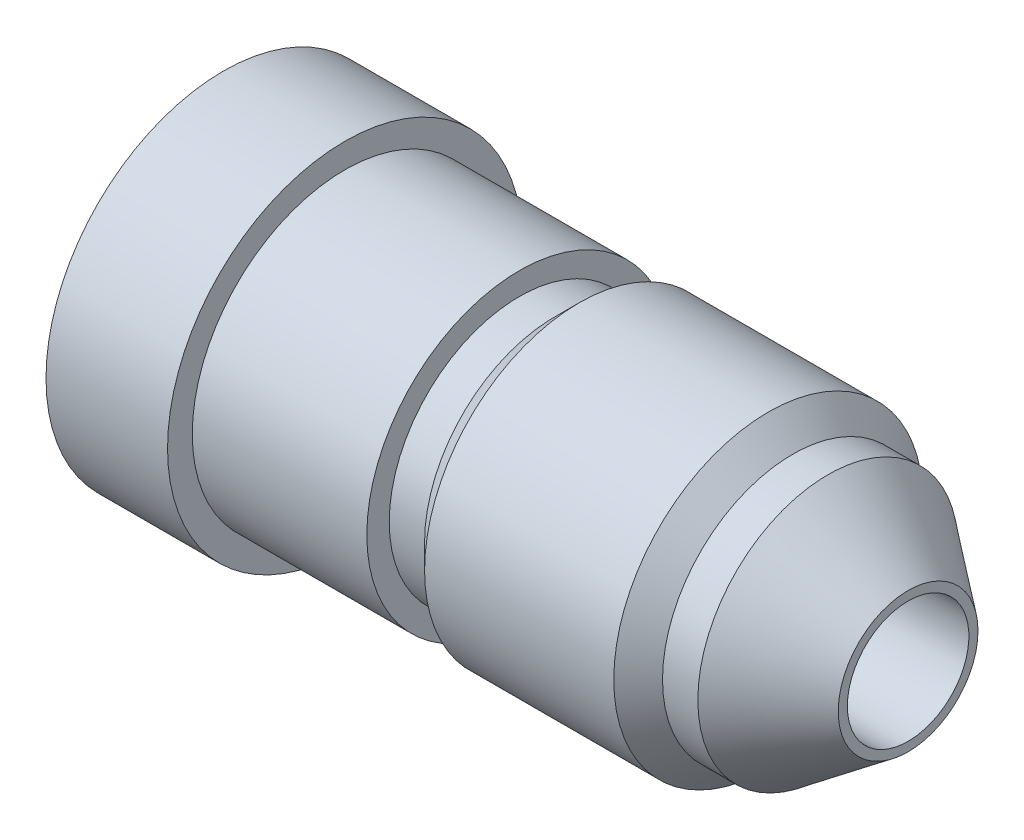
ISO-10303-21;
HEADER;
FILE_DESCRIPTION(('STEP AP214'),'2;1');
FILE_NAME('part.step','',(''),(''),'','','');
FILE_SCHEMA(('AUTOMOTIVE_DESIGN { 1 0 10303 214 1 1 1 1 }'));
ENDSEC;
DATA;
#1=APPLICATION_CONTEXT('core data for automotive mechanical design processes');
#2=APPLICATION_PROTOCOL_DEFINITION('international standard','automotive_design',2000,#1);
#3=PRODUCT_CONTEXT('',#1,'mechanical');
#4=PRODUCT('Part','Part','',(#3));
#5=PRODUCT_RELATED_PRODUCT_CATEGORY('part','',(#4));
#6=PRODUCT_DEFINITION_FORMATION('','',#4);
#7=PRODUCT_DEFINITION_CONTEXT('part definition',#1,'design');
#8=PRODUCT_DEFINITION('design','',#6,#7);
#9=PRODUCT_DEFINITION_SHAPE('','',#8);
#10=(LENGTH_UNIT() NAMED_UNIT(*) SI_UNIT(.MILLI.,.METRE.));
#11=(NAMED_UNIT(*) PLANE_ANGLE_UNIT() SI_UNIT($,.RADIAN.));
#12=(NAMED_UNIT(*) SI_UNIT($,.STERADIAN.) SOLID_ANGLE_UNIT());
#13=UNCERTAINTY_MEASURE_WITH_UNIT(LENGTH_MEASURE(1.E-05),#10,'distance_accuracy_value','');
#14=(GEOMETRIC_REPRESENTATION_CONTEXT(3) GLOBAL_UNCERTAINTY_ASSIGNED_CONTEXT((#13)) GLOBAL_UNIT_ASSIGNED_CONTEXT((#10,
#11,#12)) REPRESENTATION_CONTEXT('',''));
#15=CARTESIAN_POINT('',(0.,0.,0.));
#16=DIRECTION('',(0.,0.,1.));
#17=DIRECTION('',(1.,0.,0.));
#18=AXIS2_PLACEMENT_3D('',#15,#16,#17);
#19=CARTESIAN_POINT('',(-12.3063,0.,0.));
#20=DIRECTION('',(-1.,0.,0.));
#21=DIRECTION('',(0.,0.,1.));
#22=AXIS2_PLACEMENT_3D('',#19,#20,#21);
#23=CYLINDRICAL_SURFACE('',#22,5.55625);
#24=CARTESIAN_POINT('',(0.481989197104719,0.,0.));
#25=DIRECTION('',(1.,0.,0.));
#26=DIRECTION('',(0.,0.,-1.));
#27=AXIS2_PLACEMENT_3D('',#24,#25,#26);
#28=CIRCLE('',#27,5.55625);
#29=CARTESIAN_POINT('',(0.481989197104719,0.,-5.55625));
#30=VERTEX_POINT('',#29);
#31=EDGE_CURVE('E75',#30,#30,#28,.T.);
#32=ORIENTED_EDGE('',*,*,#31,.T.);
#33=EDGE_LOOP('',(#32));
#34=FACE_BOUND('',#33,.T.);
#35=CARTESIAN_POINT('',(7.28291304173335,0.,0.));
#36=DIRECTION('',(1.,0.,0.));
#37=DIRECTION('',(0.,0.,-1.));
#38=AXIS2_PLACEMENT_3D('',#35,#36,#37);
#39=CIRCLE('',#38,5.55625);
#40=CARTESIAN_POINT('',(7.28291304173335,0.,-5.55625));
#41=VERTEX_POINT('',#40);
#42=EDGE_CURVE('E72',#41,#41,#39,.T.);
#43=ORIENTED_EDGE('',*,*,#42,.F.);
#44=EDGE_LOOP('',(#43));
#45=FACE_BOUND('',#44,.T.);
#46=ADVANCED_FACE('F34',(#34,#45),#23,.T.);
#47=CARTESIAN_POINT('',(12.3063,2.1844,0.));
#48=DIRECTION('',(-1.,0.,0.));
#49=DIRECTION('',(0.,0.,1.));
#50=AXIS2_PLACEMENT_3D('',#47,#48,#49);
#51=PLANE('',#50);
#52=CARTESIAN_POINT('',(12.3063,0.,0.));
#53=DIRECTION('',(1.,0.,0.));
#54=DIRECTION('',(0.,0.,-1.));
#55=AXIS2_PLACEMENT_3D('',#52,#53,#54);
#56=CIRCLE('',#55,2.51206);
#57=CARTESIAN_POINT('',(12.3063,0.,-2.51206));
#58=VERTEX_POINT('',#57);
#59=EDGE_CURVE('E63',#58,#58,#56,.T.);
#60=ORIENTED_EDGE('',*,*,#59,.T.);
#61=EDGE_LOOP('',(#60));
#62=FACE_BOUND('',#61,.T.);
#63=CARTESIAN_POINT('',(12.3063,0.,0.));
#64=DIRECTION('',(-1.,0.,0.));
#65=DIRECTION('',(0.,0.,1.));
#66=AXIS2_PLACEMENT_3D('',#63,#64,#65);
#67=CIRCLE('',#66,2.1844);
#68=CARTESIAN_POINT('',(12.3063,0.,2.1844));
#69=VERTEX_POINT('',#68);
#70=EDGE_CURVE('E49',#69,#69,#67,.T.);
#71=ORIENTED_EDGE('',*,*,#70,.T.);
#72=EDGE_LOOP('',(#71));
#73=FACE_BOUND('',#72,.T.);
#74=ADVANCED_FACE('F105',(#62,#73),#51,.F.);
#75=CARTESIAN_POINT('',(-12.3063,0.,0.));
#76=DIRECTION('',(-1.,0.,0.));
#77=DIRECTION('',(0.,0.,1.));
#78=AXIS2_PLACEMENT_3D('',#75,#76,#77);
#79=CYLINDRICAL_SURFACE('',#78,6.3754);
#80=CARTESIAN_POINT('',(-12.3063,0.,0.));
#81=DIRECTION('',(-1.,0.,0.));
#82=DIRECTION('',(0.,0.,1.));
#83=AXIS2_PLACEMENT_3D('',#80,#81,#82);
#84=CIRCLE('',#83,6.3754);
#85=CARTESIAN_POINT('',(-12.3063,0.,6.3754));
#86=VERTEX_POINT('',#85);
#87=EDGE_CURVE('E60',#86,#86,#84,.T.);
#88=ORIENTED_EDGE('',*,*,#87,.F.);
#89=EDGE_LOOP('',(#88));
#90=FACE_BOUND('',#89,.T.);
#91=CARTESIAN_POINT('',(-7.9375,0.,0.));
#92=DIRECTION('',(-1.,0.,0.));
#93=DIRECTION('',(0.,0.,1.));
#94=AXIS2_PLACEMENT_3D('',#91,#92,#93);
#95=CIRCLE('',#94,6.3754);
#96=CARTESIAN_POINT('',(-7.9375,0.,6.3754));
#97=VERTEX_POINT('',#96);
#98=EDGE_CURVE('E10',#97,#97,#95,.T.);
#99=ORIENTED_EDGE('',*,*,#98,.T.);
#100=EDGE_LOOP('',(#99));
#101=FACE_BOUND('',#100,.T.);
#102=ADVANCED_FACE('F36',(#90,#101),#79,.T.);
#103=CARTESIAN_POINT('',(-7.9375,6.3754,0.));
#104=DIRECTION('',(-1.,0.,0.));
#105=DIRECTION('',(0.,0.,1.));
#106=AXIS2_PLACEMENT_3D('',#103,#104,#105);
#107=PLANE('',#106);
#108=ORIENTED_EDGE('',*,*,#98,.F.);
#109=EDGE_LOOP('',(#108));
#110=FACE_BOUND('',#109,.T.);
#111=CARTESIAN_POINT('',(-7.9375,0.,0.));
#112=DIRECTION('',(-1.,0.,0.));
#113=DIRECTION('',(0.,0.,1.));
#114=AXIS2_PLACEMENT_3D('',#111,#112,#113);
#115=CIRCLE('',#114,5.4864);
#116=CARTESIAN_POINT('',(-7.9375,0.,5.4864));
#117=VERTEX_POINT('',#116);
#118=EDGE_CURVE('E41',#117,#117,#115,.T.);
#119=ORIENTED_EDGE('',*,*,#118,.T.);
#120=EDGE_LOOP('',(#119));
#121=FACE_BOUND('',#120,.T.);
#122=ADVANCED_FACE('F119',(#110,#121),#107,.F.);
#123=CARTESIAN_POINT('',(-12.3063,0.,0.));
#124=DIRECTION('',(-1.,0.,0.));
#125=DIRECTION('',(0.,0.,1.));
#126=AXIS2_PLACEMENT_3D('',#123,#124,#125);
#127=CYLINDRICAL_SURFACE('',#126,5.4864);
#128=ORIENTED_EDGE('',*,*,#118,.F.);
#129=EDGE_LOOP('',(#128));
#130=FACE_BOUND('',#129,.T.);
#131=CARTESIAN_POINT('',(-1.6637,0.,0.));
#132=DIRECTION('',(-1.,0.,0.));
#133=DIRECTION('',(0.,0.,1.));
#134=AXIS2_PLACEMENT_3D('',#131,#132,#133);
#135=CIRCLE('',#134,5.4864);
#136=CARTESIAN_POINT('',(-1.6637,0.,5.4864));
#137=VERTEX_POINT('',#136);
#138=EDGE_CURVE('E45',#137,#137,#135,.T.);
#139=ORIENTED_EDGE('',*,*,#138,.T.);
#140=EDGE_LOOP('',(#139));
#141=FACE_BOUND('',#140,.T.);
#142=ADVANCED_FACE('F116',(#130,#141),#127,.T.);
#143=CARTESIAN_POINT('',(-12.3063,0.,0.));
#144=DIRECTION('',(-1.,0.,0.));
#145=DIRECTION('',(0.,0.,1.));
#146=AXIS2_PLACEMENT_3D('',#143,#144,#145);
#147=CYLINDRICAL_SURFACE('',#146,2.1844);
#148=ORIENTED_EDGE('',*,*,#70,.F.);
#149=EDGE_LOOP('',(#148));
#150=FACE_BOUND('',#149,.T.);
#151=CARTESIAN_POINT('',(-7.77271677589813,0.,0.));
#152=DIRECTION('',(-1.,0.,0.));
#153=DIRECTION('',(0.,0.,1.));
#154=AXIS2_PLACEMENT_3D('',#151,#152,#153);
#155=CIRCLE('',#154,2.1844);
#156=CARTESIAN_POINT('',(-7.77271677589813,0.,2.1844));
#157=VERTEX_POINT('',#156);
#158=EDGE_CURVE('E54',#157,#157,#155,.T.);
#159=ORIENTED_EDGE('',*,*,#158,.T.);
#160=EDGE_LOOP('',(#159));
#161=FACE_BOUND('',#160,.T.);
#162=ADVANCED_FACE('F118',(#150,#161),#147,.F.);
#163=CARTESIAN_POINT('',(-12.3063,0.,0.));
#164=DIRECTION('',(-1.,0.,0.));
#165=DIRECTION('',(0.,0.,1.));
#166=AXIS2_PLACEMENT_3D('',#163,#164,#165);
#167=CONICAL_SURFACE('',#166,5.6007,0.645771823237896);
#168=ORIENTED_EDGE('',*,*,#158,.F.);
#169=EDGE_LOOP('',(#168));
#170=FACE_BOUND('',#169,.T.);
#171=CARTESIAN_POINT('',(-12.3063,0.,0.));
#172=DIRECTION('',(-1.,0.,0.));
#173=DIRECTION('',(0.,0.,1.));
#174=AXIS2_PLACEMENT_3D('',#171,#172,#173);
#175=CIRCLE('',#174,5.6007);
#176=CARTESIAN_POINT('',(-12.3063,0.,5.6007));
#177=VERTEX_POINT('',#176);
#178=EDGE_CURVE('E57',#177,#177,#175,.T.);
#179=ORIENTED_EDGE('',*,*,#178,.T.);
#180=EDGE_LOOP('',(#179));
#181=FACE_BOUND('',#180,.T.);
#182=ADVANCED_FACE('F100',(#170,#181),#167,.F.);
#183=CARTESIAN_POINT('',(-12.3063,6.3754,0.));
#184=DIRECTION('',(1.,0.,0.));
#185=DIRECTION('',(0.,0.,-1.));
#186=AXIS2_PLACEMENT_3D('',#183,#184,#185);
#187=PLANE('',#186);
#188=ORIENTED_EDGE('',*,*,#178,.F.);
#189=EDGE_LOOP('',(#188));
#190=FACE_BOUND('',#189,.T.);
#191=ORIENTED_EDGE('',*,*,#87,.T.);
#192=EDGE_LOOP('',(#191));
#193=FACE_BOUND('',#192,.T.);
#194=ADVANCED_FACE('F90',(#190,#193),#187,.F.);
#195=CARTESIAN_POINT('',(-1.6637,5.4864,0.));
#196=DIRECTION('',(1.,0.,0.));
#197=DIRECTION('',(0.,0.,-1.));
#198=AXIS2_PLACEMENT_3D('',#195,#196,#197);
#199=PLANE('',#198);
#200=ORIENTED_EDGE('',*,*,#138,.F.);
#201=EDGE_LOOP('',(#200));
#202=FACE_BOUND('',#201,.T.);
#203=CARTESIAN_POINT('',(-1.66369999999997,0.,0.));
#204=DIRECTION('',(1.,0.,0.));
#205=DIRECTION('',(0.,0.,-1.));
#206=AXIS2_PLACEMENT_3D('',#203,#204,#205);
#207=CIRCLE('',#206,4.68056080289531);
#208=CARTESIAN_POINT('',(-1.66369999999997,0.,-4.68056080289531));
#209=VERTEX_POINT('',#208);
#210=EDGE_CURVE('E81',#209,#209,#207,.T.);
#211=ORIENTED_EDGE('',*,*,#210,.F.);
#212=EDGE_LOOP('',(#211));
#213=FACE_BOUND('',#212,.T.);
#214=ADVANCED_FACE('F87',(#202,#213),#199,.T.);
#215=CARTESIAN_POINT('',(9.42860223883804,0.,0.));
#216=DIRECTION('',(-1.,0.,0.));
#217=DIRECTION('',(0.,0.,1.));
#218=AXIS2_PLACEMENT_3D('',#215,#216,#217);
#219=CONICAL_SURFACE('',#218,4.68056080289531,0.645771823237896);
#220=ORIENTED_EDGE('',*,*,#59,.F.);
#221=EDGE_LOOP('',(#220));
#222=FACE_BOUND('',#221,.T.);
#223=CARTESIAN_POINT('',(9.42860223883804,0.,0.));
#224=DIRECTION('',(1.,0.,0.));
#225=DIRECTION('',(0.,0.,-1.));
#226=AXIS2_PLACEMENT_3D('',#223,#224,#225);
#227=CIRCLE('',#226,4.68056080289531);
#228=CARTESIAN_POINT('',(9.42860223883804,0.,-4.68056080289531));
#229=VERTEX_POINT('',#228);
#230=EDGE_CURVE('E66',#229,#229,#227,.T.);
#231=ORIENTED_EDGE('',*,*,#230,.T.);
#232=EDGE_LOOP('',(#231));
#233=FACE_BOUND('',#232,.T.);
#234=ADVANCED_FACE('F89',(#222,#233),#219,.T.);
#235=CARTESIAN_POINT('',(0.,0.,0.));
#236=DIRECTION('',(1.,0.,0.));
#237=DIRECTION('',(0.,0.,-1.));
#238=AXIS2_PLACEMENT_3D('',#235,#236,#237);
#239=CYLINDRICAL_SURFACE('',#238,4.68056080289531);
#240=ORIENTED_EDGE('',*,*,#230,.F.);
#241=EDGE_LOOP('',(#240));
#242=FACE_BOUND('',#241,.T.);
#243=CARTESIAN_POINT('',(8.15860223883804,0.,0.));
#244=DIRECTION('',(1.,0.,0.));
#245=DIRECTION('',(0.,0.,-1.));
#246=AXIS2_PLACEMENT_3D('',#243,#244,#245);
#247=CIRCLE('',#246,4.68056080289531);
#248=CARTESIAN_POINT('',(8.15860223883804,0.,-4.68056080289531));
#249=VERTEX_POINT('',#248);
#250=EDGE_CURVE('E69',#249,#249,#247,.T.);
#251=ORIENTED_EDGE('',*,*,#250,.T.);
#252=EDGE_LOOP('',(#251));
#253=FACE_BOUND('',#252,.T.);
#254=ADVANCED_FACE('F97',(#242,#253),#239,.T.);
#255=CARTESIAN_POINT('',(7.28291304173335,0.,0.));
#256=DIRECTION('',(-1.,0.,0.));
#257=DIRECTION('',(0.,0.,1.));
#258=AXIS2_PLACEMENT_3D('',#255,#256,#257);
#259=CONICAL_SURFACE('',#258,5.55625,0.78539816339745);
#260=ORIENTED_EDGE('',*,*,#42,.T.);
#261=EDGE_LOOP('',(#260));
#262=FACE_BOUND('',#261,.T.);
#263=ORIENTED_EDGE('',*,*,#250,.F.);
#264=EDGE_LOOP('',(#263));
#265=FACE_BOUND('',#264,.T.);
#266=ADVANCED_FACE('F170',(#262,#265),#259,.T.);
#267=CARTESIAN_POINT('',(-0.393699999999967,0.,0.));
#268=DIRECTION('',(1.,0.,0.));
#269=DIRECTION('',(0.,0.,-1.));
#270=AXIS2_PLACEMENT_3D('',#267,#268,#269);
#271=CONICAL_SURFACE('',#270,4.68056080289531,0.78539816339745);
#272=ORIENTED_EDGE('',*,*,#31,.F.);
#273=EDGE_LOOP('',(#272));
#274=FACE_BOUND('',#273,.T.);
#275=CARTESIAN_POINT('',(-0.393699999999967,0.,0.));
#276=DIRECTION('',(1.,0.,0.));
#277=DIRECTION('',(0.,0.,-1.));
#278=AXIS2_PLACEMENT_3D('',#275,#276,#277);
#279=CIRCLE('',#278,4.68056080289531);
#280=CARTESIAN_POINT('',(-0.393699999999967,0.,-4.68056080289531));
#281=VERTEX_POINT('',#280);
#282=EDGE_CURVE('E78',#281,#281,#279,.T.);
#283=ORIENTED_EDGE('',*,*,#282,.T.);
#284=EDGE_LOOP('',(#283));
#285=FACE_BOUND('',#284,.T.);
#286=ADVANCED_FACE('F182',(#274,#285),#271,.T.);
#287=CARTESIAN_POINT('',(0.,0.,0.));
#288=DIRECTION('',(1.,0.,0.));
#289=DIRECTION('',(0.,0.,-1.));
#290=AXIS2_PLACEMENT_3D('',#287,#288,#289);
#291=CYLINDRICAL_SURFACE('',#290,4.68056080289531);
#292=ORIENTED_EDGE('',*,*,#282,.F.);
#293=EDGE_LOOP('',(#292));
#294=FACE_BOUND('',#293,.T.);
#295=ORIENTED_EDGE('',*,*,#210,.T.);
#296=EDGE_LOOP('',(#295));
#297=FACE_BOUND('',#296,.T.);
#298=ADVANCED_FACE('F85',(#294,#297),#291,.T.);
#299=CLOSED_SHELL('',(#46,#74,#102,#122,#142,#162,#182,#194,#214,#234,#254,#266,#286,#298));
#300=MANIFOLD_SOLID_BREP('B2',#299);
#301=ADVANCED_BREP_SHAPE_REPRESENTATION('',(#18,#300),#14);
#302=SHAPE_DEFINITION_REPRESENTATION(#9,#301);
ENDSEC;
END-ISO-10303-21;
